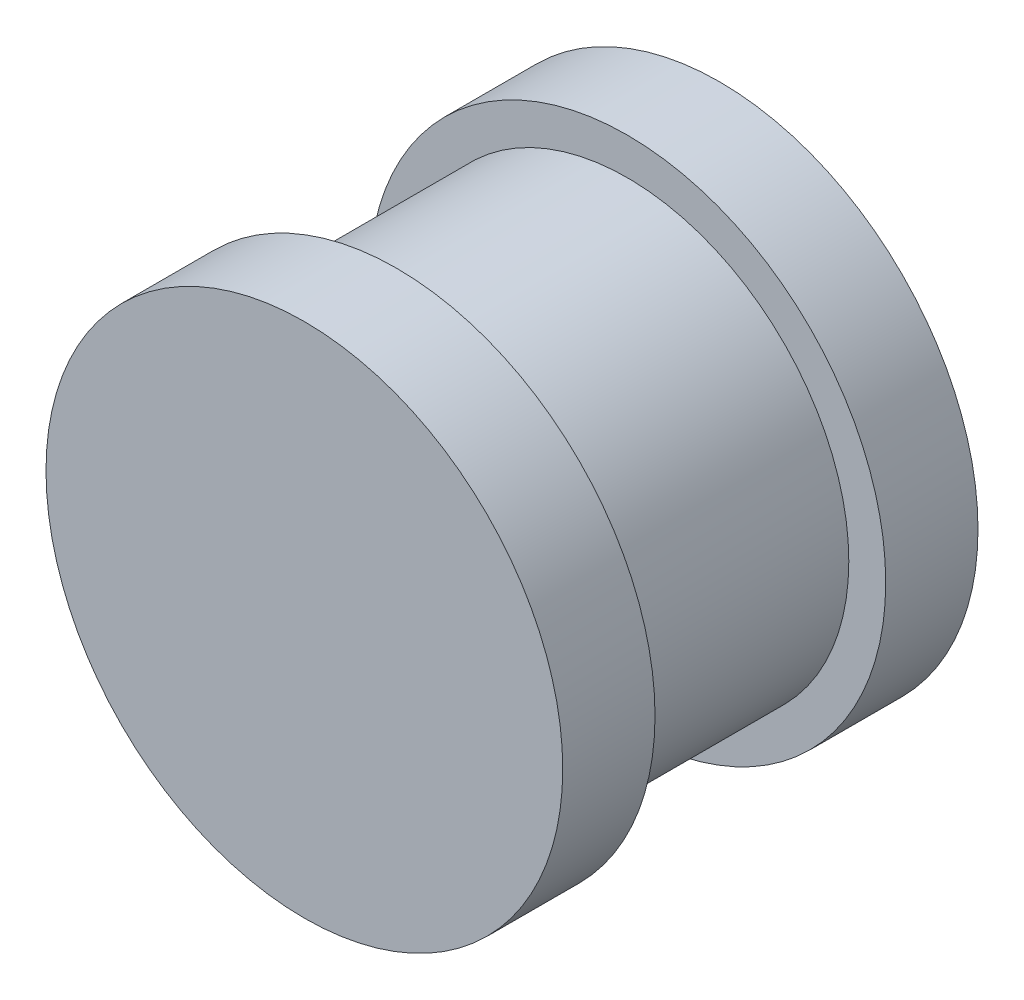
ISO-10303-21;
HEADER;
FILE_DESCRIPTION(('STEP AP214'),'2;1');
FILE_NAME('part.step','',(''),(''),'','','');
FILE_SCHEMA(('AUTOMOTIVE_DESIGN { 1 0 10303 214 1 1 1 1 }'));
ENDSEC;
DATA;
#1=APPLICATION_CONTEXT('core data for automotive mechanical design processes');
#2=APPLICATION_PROTOCOL_DEFINITION('international standard','automotive_design',2000,#1);
#3=PRODUCT_CONTEXT('',#1,'mechanical');
#4=PRODUCT('Part','Part','',(#3));
#5=PRODUCT_RELATED_PRODUCT_CATEGORY('part','',(#4));
#6=PRODUCT_DEFINITION_FORMATION('','',#4);
#7=PRODUCT_DEFINITION_CONTEXT('part definition',#1,'design');
#8=PRODUCT_DEFINITION('design','',#6,#7);
#9=PRODUCT_DEFINITION_SHAPE('','',#8);
#10=(LENGTH_UNIT() NAMED_UNIT(*) SI_UNIT(.MILLI.,.METRE.));
#11=(NAMED_UNIT(*) PLANE_ANGLE_UNIT() SI_UNIT($,.RADIAN.));
#12=(NAMED_UNIT(*) SI_UNIT($,.STERADIAN.) SOLID_ANGLE_UNIT());
#13=UNCERTAINTY_MEASURE_WITH_UNIT(LENGTH_MEASURE(1.E-05),#10,'distance_accuracy_value','');
#14=(GEOMETRIC_REPRESENTATION_CONTEXT(3) GLOBAL_UNCERTAINTY_ASSIGNED_CONTEXT((#13)) GLOBAL_UNIT_ASSIGNED_CONTEXT((#10,
#11,#12)) REPRESENTATION_CONTEXT('',''));
#15=CARTESIAN_POINT('',(0.,0.,0.));
#16=DIRECTION('',(0.,0.,1.));
#17=DIRECTION('',(1.,0.,0.));
#18=AXIS2_PLACEMENT_3D('',#15,#16,#17);
#19=CARTESIAN_POINT('',(0.,0.,0.));
#20=DIRECTION('',(0.,0.,-1.));
#21=DIRECTION('',(-1.,0.,0.));
#22=AXIS2_PLACEMENT_3D('',#19,#20,#21);
#23=PLANE('',#22);
#24=CARTESIAN_POINT('',(0.,0.,0.));
#25=DIRECTION('',(0.,0.,1.));
#26=DIRECTION('',(1.,0.,0.));
#27=AXIS2_PLACEMENT_3D('',#24,#25,#26);
#28=CIRCLE('',#27,2.8);
#29=CARTESIAN_POINT('',(2.8,0.,0.));
#30=VERTEX_POINT('',#29);
#31=EDGE_CURVE('E10',#30,#30,#28,.T.);
#32=ORIENTED_EDGE('',*,*,#31,.F.);
#33=EDGE_LOOP('',(#32));
#34=FACE_BOUND('',#33,.T.);
#35=ADVANCED_FACE('F37',(#34),#23,.T.);
#36=CARTESIAN_POINT('',(0.,0.,4.5));
#37=DIRECTION('',(0.,0.,1.));
#38=DIRECTION('',(1.,0.,0.));
#39=AXIS2_PLACEMENT_3D('',#36,#37,#38);
#40=CYLINDRICAL_SURFACE('',#39,2.8);
#41=ORIENTED_EDGE('',*,*,#31,.T.);
#42=EDGE_LOOP('',(#41));
#43=FACE_BOUND('',#42,.T.);
#44=CARTESIAN_POINT('',(0.,0.,1.));
#45=DIRECTION('',(0.,0.,1.));
#46=DIRECTION('',(1.,0.,0.));
#47=AXIS2_PLACEMENT_3D('',#44,#45,#46);
#48=CIRCLE('',#47,2.8);
#49=CARTESIAN_POINT('',(2.8,0.,1.));
#50=VERTEX_POINT('',#49);
#51=EDGE_CURVE('E44',#50,#50,#48,.T.);
#52=ORIENTED_EDGE('',*,*,#51,.F.);
#53=EDGE_LOOP('',(#52));
#54=FACE_BOUND('',#53,.T.);
#55=ADVANCED_FACE('F85',(#43,#54),#40,.T.);
#56=CARTESIAN_POINT('',(2.8,0.,1.));
#57=DIRECTION('',(0.,0.,1.));
#58=DIRECTION('',(1.,0.,0.));
#59=AXIS2_PLACEMENT_3D('',#56,#57,#58);
#60=PLANE('',#59);
#61=ORIENTED_EDGE('',*,*,#51,.T.);
#62=EDGE_LOOP('',(#61));
#63=FACE_BOUND('',#62,.T.);
#64=CARTESIAN_POINT('',(0.,0.,1.));
#65=DIRECTION('',(0.,0.,1.));
#66=DIRECTION('',(1.,0.,0.));
#67=AXIS2_PLACEMENT_3D('',#64,#65,#66);
#68=CIRCLE('',#67,2.4);
#69=CARTESIAN_POINT('',(2.4,0.,1.));
#70=VERTEX_POINT('',#69);
#71=EDGE_CURVE('E51',#70,#70,#68,.T.);
#72=ORIENTED_EDGE('',*,*,#71,.F.);
#73=EDGE_LOOP('',(#72));
#74=FACE_BOUND('',#73,.T.);
#75=ADVANCED_FACE('F90',(#63,#74),#60,.T.);
#76=CARTESIAN_POINT('',(0.,0.,4.5));
#77=DIRECTION('',(0.,0.,1.));
#78=DIRECTION('',(1.,0.,0.));
#79=AXIS2_PLACEMENT_3D('',#76,#77,#78);
#80=CYLINDRICAL_SURFACE('',#79,2.4);
#81=ORIENTED_EDGE('',*,*,#71,.T.);
#82=EDGE_LOOP('',(#81));
#83=FACE_BOUND('',#82,.T.);
#84=CARTESIAN_POINT('',(0.,0.,3.5));
#85=DIRECTION('',(0.,0.,1.));
#86=DIRECTION('',(1.,0.,0.));
#87=AXIS2_PLACEMENT_3D('',#84,#85,#86);
#88=CIRCLE('',#87,2.4);
#89=CARTESIAN_POINT('',(2.4,0.,3.5));
#90=VERTEX_POINT('',#89);
#91=EDGE_CURVE('E57',#90,#90,#88,.T.);
#92=ORIENTED_EDGE('',*,*,#91,.F.);
#93=EDGE_LOOP('',(#92));
#94=FACE_BOUND('',#93,.T.);
#95=ADVANCED_FACE('F81',(#83,#94),#80,.T.);
#96=CARTESIAN_POINT('',(2.4,0.,3.5));
#97=DIRECTION('',(0.,0.,-1.));
#98=DIRECTION('',(-1.,0.,0.));
#99=AXIS2_PLACEMENT_3D('',#96,#97,#98);
#100=PLANE('',#99);
#101=ORIENTED_EDGE('',*,*,#91,.T.);
#102=EDGE_LOOP('',(#101));
#103=FACE_BOUND('',#102,.T.);
#104=CARTESIAN_POINT('',(0.,0.,3.5));
#105=DIRECTION('',(0.,0.,1.));
#106=DIRECTION('',(1.,0.,0.));
#107=AXIS2_PLACEMENT_3D('',#104,#105,#106);
#108=CIRCLE('',#107,2.8);
#109=CARTESIAN_POINT('',(2.8,0.,3.5));
#110=VERTEX_POINT('',#109);
#111=EDGE_CURVE('E62',#110,#110,#108,.T.);
#112=ORIENTED_EDGE('',*,*,#111,.F.);
#113=EDGE_LOOP('',(#112));
#114=FACE_BOUND('',#113,.T.);
#115=ADVANCED_FACE('F73',(#103,#114),#100,.T.);
#116=CARTESIAN_POINT('',(0.,0.,4.5));
#117=DIRECTION('',(0.,0.,1.));
#118=DIRECTION('',(1.,0.,0.));
#119=AXIS2_PLACEMENT_3D('',#116,#117,#118);
#120=CYLINDRICAL_SURFACE('',#119,2.8);
#121=ORIENTED_EDGE('',*,*,#111,.T.);
#122=EDGE_LOOP('',(#121));
#123=FACE_BOUND('',#122,.T.);
#124=CARTESIAN_POINT('',(0.,0.,4.5));
#125=DIRECTION('',(0.,0.,1.));
#126=DIRECTION('',(1.,0.,0.));
#127=AXIS2_PLACEMENT_3D('',#124,#125,#126);
#128=CIRCLE('',#127,2.8);
#129=CARTESIAN_POINT('',(2.8,0.,4.5));
#130=VERTEX_POINT('',#129);
#131=EDGE_CURVE('E65',#130,#130,#128,.T.);
#132=ORIENTED_EDGE('',*,*,#131,.F.);
#133=EDGE_LOOP('',(#132));
#134=FACE_BOUND('',#133,.T.);
#135=ADVANCED_FACE('F71',(#123,#134),#120,.T.);
#136=CARTESIAN_POINT('',(2.8,0.,4.5));
#137=DIRECTION('',(0.,0.,1.));
#138=DIRECTION('',(1.,0.,0.));
#139=AXIS2_PLACEMENT_3D('',#136,#137,#138);
#140=PLANE('',#139);
#141=ORIENTED_EDGE('',*,*,#131,.T.);
#142=EDGE_LOOP('',(#141));
#143=FACE_BOUND('',#142,.T.);
#144=ADVANCED_FACE('F69',(#143),#140,.T.);
#145=CLOSED_SHELL('',(#35,#55,#75,#95,#115,#135,#144));
#146=MANIFOLD_SOLID_BREP('B2',#145);
#147=ADVANCED_BREP_SHAPE_REPRESENTATION('',(#18,#146),#14);
#148=SHAPE_DEFINITION_REPRESENTATION(#9,#147);
ENDSEC;
END-ISO-10303-21;
